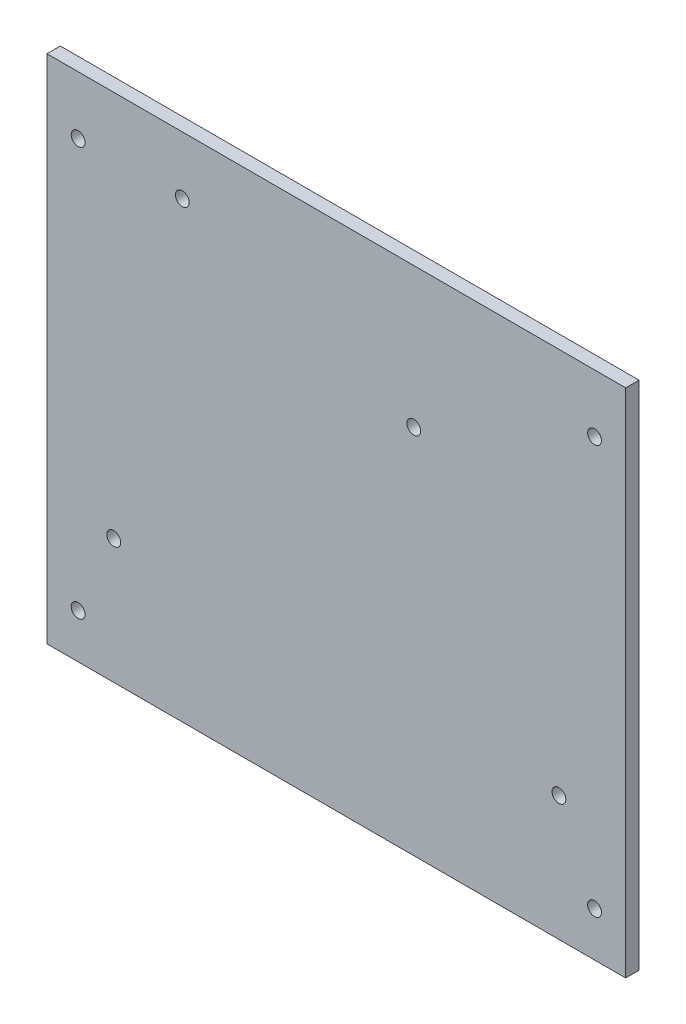
ISO-10303-21;
HEADER;
FILE_DESCRIPTION(('STEP AP214'),'2;1');
FILE_NAME('part.step','',(''),(''),'','','');
FILE_SCHEMA(('AUTOMOTIVE_DESIGN { 1 0 10303 214 1 1 1 1 }'));
ENDSEC;
DATA;
#1=APPLICATION_CONTEXT('core data for automotive mechanical design processes');
#2=APPLICATION_PROTOCOL_DEFINITION('international standard','automotive_design',2000,#1);
#3=PRODUCT_CONTEXT('',#1,'mechanical');
#4=PRODUCT('Part','Part','',(#3));
#5=PRODUCT_RELATED_PRODUCT_CATEGORY('part','',(#4));
#6=PRODUCT_DEFINITION_FORMATION('','',#4);
#7=PRODUCT_DEFINITION_CONTEXT('part definition',#1,'design');
#8=PRODUCT_DEFINITION('design','',#6,#7);
#9=PRODUCT_DEFINITION_SHAPE('','',#8);
#10=(LENGTH_UNIT() NAMED_UNIT(*) SI_UNIT(.MILLI.,.METRE.));
#11=(NAMED_UNIT(*) PLANE_ANGLE_UNIT() SI_UNIT($,.RADIAN.));
#12=(NAMED_UNIT(*) SI_UNIT($,.STERADIAN.) SOLID_ANGLE_UNIT());
#13=UNCERTAINTY_MEASURE_WITH_UNIT(LENGTH_MEASURE(1.E-05),#10,'distance_accuracy_value','');
#14=(GEOMETRIC_REPRESENTATION_CONTEXT(3) GLOBAL_UNCERTAINTY_ASSIGNED_CONTEXT((#13)) GLOBAL_UNIT_ASSIGNED_CONTEXT((#10,
#11,#12)) REPRESENTATION_CONTEXT('',''));
#15=CARTESIAN_POINT('',(0.,0.,0.));
#16=DIRECTION('',(0.,0.,1.));
#17=DIRECTION('',(1.,0.,0.));
#18=AXIS2_PLACEMENT_3D('',#15,#16,#17);
#19=CARTESIAN_POINT('',(65.,-57.4,3.));
#20=DIRECTION('',(-1.,0.,0.));
#21=DIRECTION('',(0.,0.,1.));
#22=AXIS2_PLACEMENT_3D('',#19,#20,#21);
#23=PLANE('',#22);
#24=DIRECTION('',(0.,1.,0.));
#25=VECTOR('',#24,1.);
#26=CARTESIAN_POINT('',(65.,-57.4,0.));
#27=LINE('',#26,#25);
#28=CARTESIAN_POINT('',(65.,-57.4,0.));
#29=VERTEX_POINT('',#28);
#30=CARTESIAN_POINT('',(65.,57.4,0.));
#31=VERTEX_POINT('',#30);
#32=EDGE_CURVE('E97',#29,#31,#27,.T.);
#33=ORIENTED_EDGE('',*,*,#32,.T.);
#34=DIRECTION('',(0.,0.,-1.));
#35=VECTOR('',#34,1.);
#36=CARTESIAN_POINT('',(65.,57.4,3.));
#37=LINE('',#36,#35);
#38=CARTESIAN_POINT('',(65.,57.4,3.));
#39=VERTEX_POINT('',#38);
#40=EDGE_CURVE('E11',#39,#31,#37,.T.);
#41=ORIENTED_EDGE('',*,*,#40,.F.);
#42=DIRECTION('',(0.,1.,0.));
#43=VECTOR('',#42,1.);
#44=CARTESIAN_POINT('',(65.,-57.4,3.));
#45=LINE('',#44,#43);
#46=CARTESIAN_POINT('',(65.,-57.4,3.));
#47=VERTEX_POINT('',#46);
#48=EDGE_CURVE('E85',#47,#39,#45,.T.);
#49=ORIENTED_EDGE('',*,*,#48,.F.);
#50=DIRECTION('',(0.,0.,-1.));
#51=VECTOR('',#50,1.);
#52=CARTESIAN_POINT('',(65.,-57.4,3.));
#53=LINE('',#52,#51);
#54=EDGE_CURVE('E93',#47,#29,#53,.T.);
#55=ORIENTED_EDGE('',*,*,#54,.T.);
#56=EDGE_LOOP('',(#33,#41,#49,#55));
#57=FACE_BOUND('',#56,.T.);
#58=ADVANCED_FACE('F34',(#57),#23,.F.);
#59=CARTESIAN_POINT('',(-65.,57.4,3.));
#60=DIRECTION('',(0.,-1.,0.));
#61=DIRECTION('',(0.,0.,-1.));
#62=AXIS2_PLACEMENT_3D('',#59,#60,#61);
#63=PLANE('',#62);
#64=DIRECTION('',(-1.,0.,0.));
#65=VECTOR('',#64,1.);
#66=CARTESIAN_POINT('',(-65.,57.4,0.));
#67=LINE('',#66,#65);
#68=CARTESIAN_POINT('',(-65.,57.4,0.));
#69=VERTEX_POINT('',#68);
#70=EDGE_CURVE('E89',#31,#69,#67,.T.);
#71=ORIENTED_EDGE('',*,*,#70,.T.);
#72=DIRECTION('',(0.,0.,-1.));
#73=VECTOR('',#72,1.);
#74=CARTESIAN_POINT('',(-65.,57.4,3.));
#75=LINE('',#74,#73);
#76=CARTESIAN_POINT('',(-65.,57.4,3.));
#77=VERTEX_POINT('',#76);
#78=EDGE_CURVE('E42',#77,#69,#75,.T.);
#79=ORIENTED_EDGE('',*,*,#78,.F.);
#80=DIRECTION('',(-1.,0.,0.));
#81=VECTOR('',#80,1.);
#82=CARTESIAN_POINT('',(-65.,57.4,3.));
#83=LINE('',#82,#81);
#84=EDGE_CURVE('E80',#39,#77,#83,.T.);
#85=ORIENTED_EDGE('',*,*,#84,.F.);
#86=ORIENTED_EDGE('',*,*,#40,.T.);
#87=EDGE_LOOP('',(#71,#79,#85,#86));
#88=FACE_BOUND('',#87,.T.);
#89=ADVANCED_FACE('F88',(#88),#63,.F.);
#90=CARTESIAN_POINT('',(-65.,-57.4,3.));
#91=DIRECTION('',(1.,0.,0.));
#92=DIRECTION('',(0.,0.,-1.));
#93=AXIS2_PLACEMENT_3D('',#90,#91,#92);
#94=PLANE('',#93);
#95=DIRECTION('',(0.,-1.,0.));
#96=VECTOR('',#95,1.);
#97=CARTESIAN_POINT('',(-65.,-57.4,0.));
#98=LINE('',#97,#96);
#99=CARTESIAN_POINT('',(-65.,-57.4,0.));
#100=VERTEX_POINT('',#99);
#101=EDGE_CURVE('E67',#69,#100,#98,.T.);
#102=ORIENTED_EDGE('',*,*,#101,.T.);
#103=DIRECTION('',(0.,0.,-1.));
#104=VECTOR('',#103,1.);
#105=CARTESIAN_POINT('',(-65.,-57.4,3.));
#106=LINE('',#105,#104);
#107=CARTESIAN_POINT('',(-65.,-57.4,3.));
#108=VERTEX_POINT('',#107);
#109=EDGE_CURVE('E90',#108,#100,#106,.T.);
#110=ORIENTED_EDGE('',*,*,#109,.F.);
#111=DIRECTION('',(0.,-1.,0.));
#112=VECTOR('',#111,1.);
#113=CARTESIAN_POINT('',(-65.,-57.4,3.));
#114=LINE('',#113,#112);
#115=EDGE_CURVE('E83',#77,#108,#114,.T.);
#116=ORIENTED_EDGE('',*,*,#115,.F.);
#117=ORIENTED_EDGE('',*,*,#78,.T.);
#118=EDGE_LOOP('',(#102,#110,#116,#117));
#119=FACE_BOUND('',#118,.T.);
#120=ADVANCED_FACE('F91',(#119),#94,.F.);
#121=CARTESIAN_POINT('',(-65.,-57.4,3.));
#122=DIRECTION('',(0.,1.,0.));
#123=DIRECTION('',(0.,0.,1.));
#124=AXIS2_PLACEMENT_3D('',#121,#122,#123);
#125=PLANE('',#124);
#126=DIRECTION('',(1.,0.,0.));
#127=VECTOR('',#126,1.);
#128=CARTESIAN_POINT('',(-65.,-57.4,0.));
#129=LINE('',#128,#127);
#130=EDGE_CURVE('E73',#100,#29,#129,.T.);
#131=ORIENTED_EDGE('',*,*,#130,.T.);
#132=ORIENTED_EDGE('',*,*,#54,.F.);
#133=DIRECTION('',(1.,0.,0.));
#134=VECTOR('',#133,1.);
#135=CARTESIAN_POINT('',(-65.,-57.4,3.));
#136=LINE('',#135,#134);
#137=EDGE_CURVE('E50',#108,#47,#136,.T.);
#138=ORIENTED_EDGE('',*,*,#137,.F.);
#139=ORIENTED_EDGE('',*,*,#109,.T.);
#140=EDGE_LOOP('',(#131,#132,#138,#139));
#141=FACE_BOUND('',#140,.T.);
#142=ADVANCED_FACE('F105',(#141),#125,.F.);
#143=CARTESIAN_POINT('',(0.,0.,3.));
#144=DIRECTION('',(0.,0.,-1.));
#145=DIRECTION('',(-1.,0.,0.));
#146=AXIS2_PLACEMENT_3D('',#143,#144,#145);
#147=PLANE('',#146);
#148=CARTESIAN_POINT('',(-58.,44.4,3.));
#149=DIRECTION('',(0.,0.,1.));
#150=DIRECTION('',(1.,0.,0.));
#151=AXIS2_PLACEMENT_3D('',#148,#149,#150);
#152=CIRCLE('',#151,1.55);
#153=CARTESIAN_POINT('',(-56.45,44.4,3.));
#154=VERTEX_POINT('',#153);
#155=EDGE_CURVE('E136',#154,#154,#152,.T.);
#156=ORIENTED_EDGE('',*,*,#155,.F.);
#157=EDGE_LOOP('',(#156));
#158=FACE_BOUND('',#157,.T.);
#159=CARTESIAN_POINT('',(58.,44.4,3.));
#160=DIRECTION('',(0.,0.,1.));
#161=DIRECTION('',(1.,0.,0.));
#162=AXIS2_PLACEMENT_3D('',#159,#160,#161);
#163=CIRCLE('',#162,1.55);
#164=CARTESIAN_POINT('',(59.55,44.4,3.));
#165=VERTEX_POINT('',#164);
#166=EDGE_CURVE('E130',#165,#165,#163,.T.);
#167=ORIENTED_EDGE('',*,*,#166,.F.);
#168=EDGE_LOOP('',(#167));
#169=FACE_BOUND('',#168,.T.);
#170=CARTESIAN_POINT('',(58.,-47.4,3.));
#171=DIRECTION('',(0.,0.,1.));
#172=DIRECTION('',(1.,0.,0.));
#173=AXIS2_PLACEMENT_3D('',#170,#171,#172);
#174=CIRCLE('',#173,1.55);
#175=CARTESIAN_POINT('',(59.55,-47.4,3.));
#176=VERTEX_POINT('',#175);
#177=EDGE_CURVE('E124',#176,#176,#174,.T.);
#178=ORIENTED_EDGE('',*,*,#177,.F.);
#179=EDGE_LOOP('',(#178));
#180=FACE_BOUND('',#179,.T.);
#181=CARTESIAN_POINT('',(-50.,-29.4,3.));
#182=DIRECTION('',(0.,0.,1.));
#183=DIRECTION('',(1.,0.,0.));
#184=AXIS2_PLACEMENT_3D('',#181,#182,#183);
#185=CIRCLE('',#184,1.55);
#186=CARTESIAN_POINT('',(-48.45,-29.4,3.));
#187=VERTEX_POINT('',#186);
#188=EDGE_CURVE('E117',#187,#187,#185,.T.);
#189=ORIENTED_EDGE('',*,*,#188,.F.);
#190=EDGE_LOOP('',(#189));
#191=FACE_BOUND('',#190,.T.);
#192=CARTESIAN_POINT('',(17.4,25.96,3.));
#193=DIRECTION('',(0.,0.,1.));
#194=DIRECTION('',(1.,0.,0.));
#195=AXIS2_PLACEMENT_3D('',#192,#193,#194);
#196=CIRCLE('',#195,1.55);
#197=CARTESIAN_POINT('',(18.95,25.96,3.));
#198=VERTEX_POINT('',#197);
#199=EDGE_CURVE('E153',#198,#198,#196,.T.);
#200=ORIENTED_EDGE('',*,*,#199,.F.);
#201=EDGE_LOOP('',(#200));
#202=FACE_BOUND('',#201,.T.);
#203=CARTESIAN_POINT('',(-34.6,44.4,3.));
#204=DIRECTION('',(0.,0.,1.));
#205=DIRECTION('',(1.,0.,0.));
#206=AXIS2_PLACEMENT_3D('',#203,#204,#205);
#207=CIRCLE('',#206,1.55);
#208=CARTESIAN_POINT('',(-33.05,44.4,3.));
#209=VERTEX_POINT('',#208);
#210=EDGE_CURVE('E141',#209,#209,#207,.T.);
#211=ORIENTED_EDGE('',*,*,#210,.F.);
#212=EDGE_LOOP('',(#211));
#213=FACE_BOUND('',#212,.T.);
#214=CARTESIAN_POINT('',(50.,-29.4,3.));
#215=DIRECTION('',(0.,0.,1.));
#216=DIRECTION('',(1.,0.,0.));
#217=AXIS2_PLACEMENT_3D('',#214,#215,#216);
#218=CIRCLE('',#217,1.55);
#219=CARTESIAN_POINT('',(51.55,-29.4,3.));
#220=VERTEX_POINT('',#219);
#221=EDGE_CURVE('E148',#220,#220,#218,.T.);
#222=ORIENTED_EDGE('',*,*,#221,.F.);
#223=EDGE_LOOP('',(#222));
#224=FACE_BOUND('',#223,.T.);
#225=CARTESIAN_POINT('',(-58.,-47.4,3.));
#226=DIRECTION('',(0.,0.,1.));
#227=DIRECTION('',(1.,0.,0.));
#228=AXIS2_PLACEMENT_3D('',#225,#226,#227);
#229=CIRCLE('',#228,1.55);
#230=CARTESIAN_POINT('',(-56.45,-47.4,3.));
#231=VERTEX_POINT('',#230);
#232=EDGE_CURVE('E111',#231,#231,#229,.T.);
#233=ORIENTED_EDGE('',*,*,#232,.F.);
#234=EDGE_LOOP('',(#233));
#235=FACE_BOUND('',#234,.T.);
#236=ORIENTED_EDGE('',*,*,#48,.T.);
#237=ORIENTED_EDGE('',*,*,#84,.T.);
#238=ORIENTED_EDGE('',*,*,#115,.T.);
#239=ORIENTED_EDGE('',*,*,#137,.T.);
#240=EDGE_LOOP('',(#236,#237,#238,#239));
#241=FACE_BOUND('',#240,.T.);
#242=ADVANCED_FACE('F81',(#158,#169,#180,#191,#202,#213,#224,#235,#241),#147,.F.);
#243=CARTESIAN_POINT('',(0.,0.,0.));
#244=DIRECTION('',(0.,0.,-1.));
#245=DIRECTION('',(-1.,0.,0.));
#246=AXIS2_PLACEMENT_3D('',#243,#244,#245);
#247=PLANE('',#246);
#248=CARTESIAN_POINT('',(-58.,44.4,0.));
#249=DIRECTION('',(0.,0.,1.));
#250=DIRECTION('',(1.,0.,0.));
#251=AXIS2_PLACEMENT_3D('',#248,#249,#250);
#252=CIRCLE('',#251,1.55);
#253=CARTESIAN_POINT('',(-56.45,44.4,0.));
#254=VERTEX_POINT('',#253);
#255=EDGE_CURVE('E114',#254,#254,#252,.T.);
#256=ORIENTED_EDGE('',*,*,#255,.T.);
#257=EDGE_LOOP('',(#256));
#258=FACE_BOUND('',#257,.T.);
#259=CARTESIAN_POINT('',(58.,44.4,0.));
#260=DIRECTION('',(0.,0.,1.));
#261=DIRECTION('',(1.,0.,0.));
#262=AXIS2_PLACEMENT_3D('',#259,#260,#261);
#263=CIRCLE('',#262,1.55);
#264=CARTESIAN_POINT('',(59.55,44.4,0.));
#265=VERTEX_POINT('',#264);
#266=EDGE_CURVE('E133',#265,#265,#263,.T.);
#267=ORIENTED_EDGE('',*,*,#266,.T.);
#268=EDGE_LOOP('',(#267));
#269=FACE_BOUND('',#268,.T.);
#270=CARTESIAN_POINT('',(58.,-47.4,0.));
#271=DIRECTION('',(0.,0.,1.));
#272=DIRECTION('',(1.,0.,0.));
#273=AXIS2_PLACEMENT_3D('',#270,#271,#272);
#274=CIRCLE('',#273,1.55);
#275=CARTESIAN_POINT('',(59.55,-47.4,0.));
#276=VERTEX_POINT('',#275);
#277=EDGE_CURVE('E127',#276,#276,#274,.T.);
#278=ORIENTED_EDGE('',*,*,#277,.T.);
#279=EDGE_LOOP('',(#278));
#280=FACE_BOUND('',#279,.T.);
#281=CARTESIAN_POINT('',(-50.,-29.4,0.));
#282=DIRECTION('',(0.,0.,1.));
#283=DIRECTION('',(1.,0.,0.));
#284=AXIS2_PLACEMENT_3D('',#281,#282,#283);
#285=CIRCLE('',#284,1.55);
#286=CARTESIAN_POINT('',(-48.45,-29.4,0.));
#287=VERTEX_POINT('',#286);
#288=EDGE_CURVE('E120',#287,#287,#285,.T.);
#289=ORIENTED_EDGE('',*,*,#288,.T.);
#290=EDGE_LOOP('',(#289));
#291=FACE_BOUND('',#290,.T.);
#292=CARTESIAN_POINT('',(17.4,25.96,0.));
#293=DIRECTION('',(0.,0.,1.));
#294=DIRECTION('',(1.,0.,0.));
#295=AXIS2_PLACEMENT_3D('',#292,#293,#294);
#296=CIRCLE('',#295,1.55);
#297=CARTESIAN_POINT('',(18.95,25.96,0.));
#298=VERTEX_POINT('',#297);
#299=EDGE_CURVE('E145',#298,#298,#296,.T.);
#300=ORIENTED_EDGE('',*,*,#299,.T.);
#301=EDGE_LOOP('',(#300));
#302=FACE_BOUND('',#301,.T.);
#303=CARTESIAN_POINT('',(-34.6,44.4,0.));
#304=DIRECTION('',(0.,0.,1.));
#305=DIRECTION('',(1.,0.,0.));
#306=AXIS2_PLACEMENT_3D('',#303,#304,#305);
#307=CIRCLE('',#306,1.55);
#308=CARTESIAN_POINT('',(-33.05,44.4,0.));
#309=VERTEX_POINT('',#308);
#310=EDGE_CURVE('E144',#309,#309,#307,.T.);
#311=ORIENTED_EDGE('',*,*,#310,.T.);
#312=EDGE_LOOP('',(#311));
#313=FACE_BOUND('',#312,.T.);
#314=CARTESIAN_POINT('',(50.,-29.4,0.));
#315=DIRECTION('',(0.,0.,1.));
#316=DIRECTION('',(1.,0.,0.));
#317=AXIS2_PLACEMENT_3D('',#314,#315,#316);
#318=CIRCLE('',#317,1.55);
#319=CARTESIAN_POINT('',(51.55,-29.4,0.));
#320=VERTEX_POINT('',#319);
#321=EDGE_CURVE('E121',#320,#320,#318,.T.);
#322=ORIENTED_EDGE('',*,*,#321,.T.);
#323=EDGE_LOOP('',(#322));
#324=FACE_BOUND('',#323,.T.);
#325=CARTESIAN_POINT('',(-58.,-47.4,0.));
#326=DIRECTION('',(0.,0.,1.));
#327=DIRECTION('',(1.,0.,0.));
#328=AXIS2_PLACEMENT_3D('',#325,#326,#327);
#329=CIRCLE('',#328,1.55);
#330=CARTESIAN_POINT('',(-56.45,-47.4,0.));
#331=VERTEX_POINT('',#330);
#332=EDGE_CURVE('E100',#331,#331,#329,.T.);
#333=ORIENTED_EDGE('',*,*,#332,.T.);
#334=EDGE_LOOP('',(#333));
#335=FACE_BOUND('',#334,.T.);
#336=ORIENTED_EDGE('',*,*,#32,.F.);
#337=ORIENTED_EDGE('',*,*,#130,.F.);
#338=ORIENTED_EDGE('',*,*,#101,.F.);
#339=ORIENTED_EDGE('',*,*,#70,.F.);
#340=EDGE_LOOP('',(#336,#337,#338,#339));
#341=FACE_BOUND('',#340,.T.);
#342=ADVANCED_FACE('F108',(#258,#269,#280,#291,#302,#313,#324,#335,#341),#247,.T.);
#343=CARTESIAN_POINT('',(-58.,-47.4,0.));
#344=DIRECTION('',(0.,0.,1.));
#345=DIRECTION('',(1.,0.,0.));
#346=AXIS2_PLACEMENT_3D('',#343,#344,#345);
#347=CYLINDRICAL_SURFACE('',#346,1.55);
#348=ORIENTED_EDGE('',*,*,#332,.F.);
#349=EDGE_LOOP('',(#348));
#350=FACE_BOUND('',#349,.T.);
#351=ORIENTED_EDGE('',*,*,#232,.T.);
#352=EDGE_LOOP('',(#351));
#353=FACE_BOUND('',#352,.T.);
#354=ADVANCED_FACE('F179',(#350,#353),#347,.F.);
#355=CARTESIAN_POINT('',(50.,-29.4,0.));
#356=DIRECTION('',(0.,0.,1.));
#357=DIRECTION('',(1.,0.,0.));
#358=AXIS2_PLACEMENT_3D('',#355,#356,#357);
#359=CYLINDRICAL_SURFACE('',#358,1.55);
#360=ORIENTED_EDGE('',*,*,#321,.F.);
#361=EDGE_LOOP('',(#360));
#362=FACE_BOUND('',#361,.T.);
#363=ORIENTED_EDGE('',*,*,#221,.T.);
#364=EDGE_LOOP('',(#363));
#365=FACE_BOUND('',#364,.T.);
#366=ADVANCED_FACE('F181',(#362,#365),#359,.F.);
#367=CARTESIAN_POINT('',(-34.6,44.4,0.));
#368=DIRECTION('',(0.,0.,1.));
#369=DIRECTION('',(1.,0.,0.));
#370=AXIS2_PLACEMENT_3D('',#367,#368,#369);
#371=CYLINDRICAL_SURFACE('',#370,1.55);
#372=ORIENTED_EDGE('',*,*,#310,.F.);
#373=EDGE_LOOP('',(#372));
#374=FACE_BOUND('',#373,.T.);
#375=ORIENTED_EDGE('',*,*,#210,.T.);
#376=EDGE_LOOP('',(#375));
#377=FACE_BOUND('',#376,.T.);
#378=ADVANCED_FACE('F165',(#374,#377),#371,.F.);
#379=CARTESIAN_POINT('',(17.4,25.96,0.));
#380=DIRECTION('',(0.,0.,1.));
#381=DIRECTION('',(1.,0.,0.));
#382=AXIS2_PLACEMENT_3D('',#379,#380,#381);
#383=CYLINDRICAL_SURFACE('',#382,1.55);
#384=ORIENTED_EDGE('',*,*,#299,.F.);
#385=EDGE_LOOP('',(#384));
#386=FACE_BOUND('',#385,.T.);
#387=ORIENTED_EDGE('',*,*,#199,.T.);
#388=EDGE_LOOP('',(#387));
#389=FACE_BOUND('',#388,.T.);
#390=ADVANCED_FACE('F161',(#386,#389),#383,.F.);
#391=CARTESIAN_POINT('',(-50.,-29.4,0.));
#392=DIRECTION('',(0.,0.,1.));
#393=DIRECTION('',(1.,0.,0.));
#394=AXIS2_PLACEMENT_3D('',#391,#392,#393);
#395=CYLINDRICAL_SURFACE('',#394,1.55);
#396=ORIENTED_EDGE('',*,*,#288,.F.);
#397=EDGE_LOOP('',(#396));
#398=FACE_BOUND('',#397,.T.);
#399=ORIENTED_EDGE('',*,*,#188,.T.);
#400=EDGE_LOOP('',(#399));
#401=FACE_BOUND('',#400,.T.);
#402=ADVANCED_FACE('F164',(#398,#401),#395,.F.);
#403=CARTESIAN_POINT('',(58.,-47.4,0.));
#404=DIRECTION('',(0.,0.,1.));
#405=DIRECTION('',(1.,0.,0.));
#406=AXIS2_PLACEMENT_3D('',#403,#404,#405);
#407=CYLINDRICAL_SURFACE('',#406,1.55);
#408=ORIENTED_EDGE('',*,*,#277,.F.);
#409=EDGE_LOOP('',(#408));
#410=FACE_BOUND('',#409,.T.);
#411=ORIENTED_EDGE('',*,*,#177,.T.);
#412=EDGE_LOOP('',(#411));
#413=FACE_BOUND('',#412,.T.);
#414=ADVANCED_FACE('F250',(#410,#413),#407,.F.);
#415=CARTESIAN_POINT('',(58.,44.4,0.));
#416=DIRECTION('',(0.,0.,1.));
#417=DIRECTION('',(1.,0.,0.));
#418=AXIS2_PLACEMENT_3D('',#415,#416,#417);
#419=CYLINDRICAL_SURFACE('',#418,1.55);
#420=ORIENTED_EDGE('',*,*,#266,.F.);
#421=EDGE_LOOP('',(#420));
#422=FACE_BOUND('',#421,.T.);
#423=ORIENTED_EDGE('',*,*,#166,.T.);
#424=EDGE_LOOP('',(#423));
#425=FACE_BOUND('',#424,.T.);
#426=ADVANCED_FACE('F259',(#422,#425),#419,.F.);
#427=CARTESIAN_POINT('',(-58.,44.4,0.));
#428=DIRECTION('',(0.,0.,1.));
#429=DIRECTION('',(1.,0.,0.));
#430=AXIS2_PLACEMENT_3D('',#427,#428,#429);
#431=CYLINDRICAL_SURFACE('',#430,1.55);
#432=ORIENTED_EDGE('',*,*,#255,.F.);
#433=EDGE_LOOP('',(#432));
#434=FACE_BOUND('',#433,.T.);
#435=ORIENTED_EDGE('',*,*,#155,.T.);
#436=EDGE_LOOP('',(#435));
#437=FACE_BOUND('',#436,.T.);
#438=ADVANCED_FACE('F269',(#434,#437),#431,.F.);
#439=CLOSED_SHELL('',(#58,#89,#120,#142,#242,#342,#354,#366,#378,#390,#402,#414,#426,#438));
#440=MANIFOLD_SOLID_BREP('B2',#439);
#441=ADVANCED_BREP_SHAPE_REPRESENTATION('',(#18,#440),#14);
#442=SHAPE_DEFINITION_REPRESENTATION(#9,#441);
ENDSEC;
END-ISO-10303-21;
